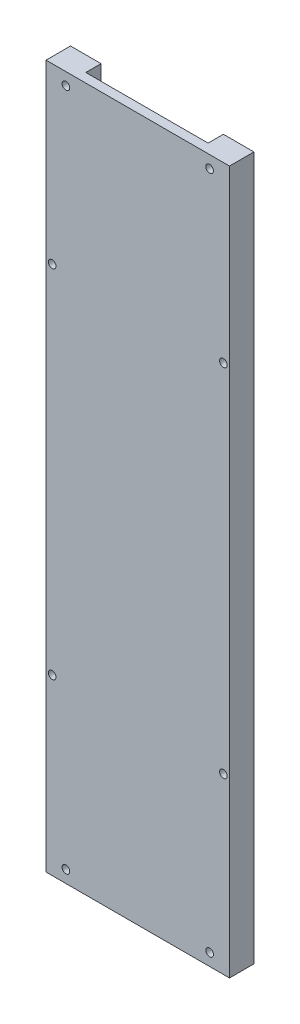
ISO-10303-21;
HEADER;
FILE_DESCRIPTION(('STEP AP214'),'2;1');
FILE_NAME('part.step','',(''),(''),'','','');
FILE_SCHEMA(('AUTOMOTIVE_DESIGN { 1 0 10303 214 1 1 1 1 }'));
ENDSEC;
DATA;
#1=APPLICATION_CONTEXT('core data for automotive mechanical design processes');
#2=APPLICATION_PROTOCOL_DEFINITION('international standard','automotive_design',2000,#1);
#3=PRODUCT_CONTEXT('',#1,'mechanical');
#4=PRODUCT('Part','Part','',(#3));
#5=PRODUCT_RELATED_PRODUCT_CATEGORY('part','',(#4));
#6=PRODUCT_DEFINITION_FORMATION('','',#4);
#7=PRODUCT_DEFINITION_CONTEXT('part definition',#1,'design');
#8=PRODUCT_DEFINITION('design','',#6,#7);
#9=PRODUCT_DEFINITION_SHAPE('','',#8);
#10=(LENGTH_UNIT() NAMED_UNIT(*) SI_UNIT(.MILLI.,.METRE.));
#11=(NAMED_UNIT(*) PLANE_ANGLE_UNIT() SI_UNIT($,.RADIAN.));
#12=(NAMED_UNIT(*) SI_UNIT($,.STERADIAN.) SOLID_ANGLE_UNIT());
#13=UNCERTAINTY_MEASURE_WITH_UNIT(LENGTH_MEASURE(1.E-05),#10,'distance_accuracy_value','');
#14=(GEOMETRIC_REPRESENTATION_CONTEXT(3) GLOBAL_UNCERTAINTY_ASSIGNED_CONTEXT((#13)) GLOBAL_UNIT_ASSIGNED_CONTEXT((#10,
#11,#12)) REPRESENTATION_CONTEXT('',''));
#15=CARTESIAN_POINT('',(0.,0.,0.));
#16=DIRECTION('',(0.,0.,1.));
#17=DIRECTION('',(1.,0.,0.));
#18=AXIS2_PLACEMENT_3D('',#15,#16,#17);
#19=CARTESIAN_POINT('',(75.000433107579,240.178928217637,30.5));
#20=DIRECTION('',(-9.09271131818108E-09,1.,0.));
#21=DIRECTION('',(0.,0.,1.));
#22=AXIS2_PLACEMENT_3D('',#19,#20,#21);
#23=PLANE('',#22);
#24=DIRECTION('',(-1.,-9.09271130611344E-09,0.));
#25=VECTOR('',#24,1.);
#26=CARTESIAN_POINT('',(55.000433107579,240.178928035783,58.));
#27=LINE('',#26,#25);
#28=CARTESIAN_POINT('',(95.000433107579,240.178928399491,58.));
#29=VERTEX_POINT('',#28);
#30=CARTESIAN_POINT('',(55.000433107579,240.178928035783,58.));
#31=VERTEX_POINT('',#30);
#32=EDGE_CURVE('E11',#29,#31,#27,.T.);
#33=ORIENTED_EDGE('',*,*,#32,.T.);
#34=DIRECTION('',(0.,0.,-1.));
#35=VECTOR('',#34,1.);
#36=CARTESIAN_POINT('',(55.000433107579,240.178928035783,53.));
#37=LINE('',#36,#35);
#38=CARTESIAN_POINT('',(55.000433107579,240.178928035783,53.));
#39=VERTEX_POINT('',#38);
#40=EDGE_CURVE('E181',#31,#39,#37,.T.);
#41=ORIENTED_EDGE('',*,*,#40,.T.);
#42=DIRECTION('',(-1.,-9.09271130611344E-09,0.));
#43=VECTOR('',#42,1.);
#44=CARTESIAN_POINT('',(45.000433107579,240.178927944856,53.));
#45=LINE('',#44,#43);
#46=CARTESIAN_POINT('',(45.000433107579,240.178927944856,53.));
#47=VERTEX_POINT('',#46);
#48=EDGE_CURVE('E206',#39,#47,#45,.T.);
#49=ORIENTED_EDGE('',*,*,#48,.T.);
#50=DIRECTION('',(0.,0.,1.));
#51=VECTOR('',#50,1.);
#52=CARTESIAN_POINT('',(45.000433107579,240.178927944856,61.));
#53=LINE('',#52,#51);
#54=CARTESIAN_POINT('',(45.000433107579,240.178927944856,61.));
#55=VERTEX_POINT('',#54);
#56=EDGE_CURVE('E201',#47,#55,#53,.T.);
#57=ORIENTED_EDGE('',*,*,#56,.T.);
#58=DIRECTION('',(1.,9.09271130611344E-09,0.));
#59=VECTOR('',#58,1.);
#60=CARTESIAN_POINT('',(105.000433107579,240.178928490418,61.));
#61=LINE('',#60,#59);
#62=CARTESIAN_POINT('',(105.000433107579,240.178928490418,61.));
#63=VERTEX_POINT('',#62);
#64=EDGE_CURVE('E281',#55,#63,#61,.T.);
#65=ORIENTED_EDGE('',*,*,#64,.T.);
#66=DIRECTION('',(0.,0.,-1.));
#67=VECTOR('',#66,1.);
#68=CARTESIAN_POINT('',(105.000433107579,240.178928490418,53.));
#69=LINE('',#68,#67);
#70=CARTESIAN_POINT('',(105.000433107579,240.178928490418,53.));
#71=VERTEX_POINT('',#70);
#72=EDGE_CURVE('E259',#63,#71,#69,.T.);
#73=ORIENTED_EDGE('',*,*,#72,.T.);
#74=DIRECTION('',(-1.,-9.09271130611344E-09,0.));
#75=VECTOR('',#74,1.);
#76=CARTESIAN_POINT('',(45.000433107579,240.178927944856,53.));
#77=LINE('',#76,#75);
#78=CARTESIAN_POINT('',(95.000433107579,240.178928399491,53.));
#79=VERTEX_POINT('',#78);
#80=EDGE_CURVE('E190',#71,#79,#77,.T.);
#81=ORIENTED_EDGE('',*,*,#80,.T.);
#82=DIRECTION('',(0.,0.,1.));
#83=VECTOR('',#82,1.);
#84=CARTESIAN_POINT('',(95.000433107579,240.178928399491,58.));
#85=LINE('',#84,#83);
#86=EDGE_CURVE('E229',#79,#29,#85,.T.);
#87=ORIENTED_EDGE('',*,*,#86,.T.);
#88=EDGE_LOOP('',(#33,#41,#49,#57,#65,#73,#81,#87));
#89=FACE_BOUND('',#88,.T.);
#90=ADVANCED_FACE('F16',(#89),#23,.T.);
#91=CARTESIAN_POINT('',(75.0004351989026,10.1789282176369,30.5));
#92=DIRECTION('',(9.09271130611344E-09,-1.,0.));
#93=DIRECTION('',(0.,0.,-1.));
#94=AXIS2_PLACEMENT_3D('',#91,#92,#93);
#95=PLANE('',#94);
#96=DIRECTION('',(1.,9.09271130611344E-09,0.));
#97=VECTOR('',#96,1.);
#98=CARTESIAN_POINT('',(55.0004351989026,10.1789280357827,58.));
#99=LINE('',#98,#97);
#100=CARTESIAN_POINT('',(55.0004351989026,10.1789280357827,58.));
#101=VERTEX_POINT('',#100);
#102=CARTESIAN_POINT('',(95.0004351989026,10.1789283994911,58.));
#103=VERTEX_POINT('',#102);
#104=EDGE_CURVE('E27',#101,#103,#99,.T.);
#105=ORIENTED_EDGE('',*,*,#104,.T.);
#106=DIRECTION('',(0.,0.,-1.));
#107=VECTOR('',#106,1.);
#108=CARTESIAN_POINT('',(95.0004351989026,10.1789283994911,58.));
#109=LINE('',#108,#107);
#110=CARTESIAN_POINT('',(95.0004351989026,10.1789283994911,53.));
#111=VERTEX_POINT('',#110);
#112=EDGE_CURVE('E264',#103,#111,#109,.T.);
#113=ORIENTED_EDGE('',*,*,#112,.T.);
#114=DIRECTION('',(1.,9.09271130611344E-09,0.));
#115=VECTOR('',#114,1.);
#116=CARTESIAN_POINT('',(45.0004351989026,10.1789279448555,53.));
#117=LINE('',#116,#115);
#118=CARTESIAN_POINT('',(105.000435198903,10.1789284904182,53.));
#119=VERTEX_POINT('',#118);
#120=EDGE_CURVE('E194',#111,#119,#117,.T.);
#121=ORIENTED_EDGE('',*,*,#120,.T.);
#122=DIRECTION('',(0.,0.,1.));
#123=VECTOR('',#122,1.);
#124=CARTESIAN_POINT('',(105.000435198903,10.1789284904182,53.));
#125=LINE('',#124,#123);
#126=CARTESIAN_POINT('',(105.000435198903,10.1789284904182,61.));
#127=VERTEX_POINT('',#126);
#128=EDGE_CURVE('E224',#119,#127,#125,.T.);
#129=ORIENTED_EDGE('',*,*,#128,.T.);
#130=DIRECTION('',(-1.,-9.09271130611344E-09,0.));
#131=VECTOR('',#130,1.);
#132=CARTESIAN_POINT('',(105.000435198903,10.1789284904182,61.));
#133=LINE('',#132,#131);
#134=CARTESIAN_POINT('',(45.0004351989026,10.1789279448555,61.));
#135=VERTEX_POINT('',#134);
#136=EDGE_CURVE('E258',#127,#135,#133,.T.);
#137=ORIENTED_EDGE('',*,*,#136,.T.);
#138=DIRECTION('',(0.,0.,-1.));
#139=VECTOR('',#138,1.);
#140=CARTESIAN_POINT('',(45.0004351989026,10.1789279448555,61.));
#141=LINE('',#140,#139);
#142=CARTESIAN_POINT('',(45.0004351989026,10.1789279448555,53.));
#143=VERTEX_POINT('',#142);
#144=EDGE_CURVE('E205',#135,#143,#141,.T.);
#145=ORIENTED_EDGE('',*,*,#144,.T.);
#146=DIRECTION('',(1.,9.09271130611344E-09,0.));
#147=VECTOR('',#146,1.);
#148=CARTESIAN_POINT('',(45.0004351989026,10.1789279448555,53.));
#149=LINE('',#148,#147);
#150=CARTESIAN_POINT('',(55.0004351989026,10.1789280357827,53.));
#151=VERTEX_POINT('',#150);
#152=EDGE_CURVE('E209',#143,#151,#149,.T.);
#153=ORIENTED_EDGE('',*,*,#152,.T.);
#154=DIRECTION('',(0.,0.,1.));
#155=VECTOR('',#154,1.);
#156=CARTESIAN_POINT('',(55.0004351989026,10.1789280357827,53.));
#157=LINE('',#156,#155);
#158=EDGE_CURVE('E185',#151,#101,#157,.T.);
#159=ORIENTED_EDGE('',*,*,#158,.T.);
#160=EDGE_LOOP('',(#105,#113,#121,#129,#137,#145,#153,#159));
#161=FACE_BOUND('',#160,.T.);
#162=ADVANCED_FACE('F364',(#161),#95,.T.);
#163=CARTESIAN_POINT('',(95.0004351989026,10.1789283994911,58.));
#164=DIRECTION('',(0.,0.,-1.));
#165=DIRECTION('',(0.,-1.,0.));
#166=AXIS2_PLACEMENT_3D('',#163,#164,#165);
#167=PLANE('',#166);
#168=ORIENTED_EDGE('',*,*,#104,.F.);
#169=DIRECTION('',(-9.09271131818108E-09,1.,0.));
#170=VECTOR('',#169,1.);
#171=CARTESIAN_POINT('',(55.0004351989026,10.1789280357827,58.));
#172=LINE('',#171,#170);
#173=EDGE_CURVE('E184',#101,#31,#172,.T.);
#174=ORIENTED_EDGE('',*,*,#173,.T.);
#175=ORIENTED_EDGE('',*,*,#32,.F.);
#176=DIRECTION('',(-9.09271131818108E-09,1.,0.));
#177=VECTOR('',#176,1.);
#178=CARTESIAN_POINT('',(95.0004351989026,10.1789283994911,58.));
#179=LINE('',#178,#177);
#180=EDGE_CURVE('E247',#103,#29,#179,.T.);
#181=ORIENTED_EDGE('',*,*,#180,.F.);
#182=EDGE_LOOP('',(#168,#174,#175,#181));
#183=FACE_BOUND('',#182,.T.);
#184=ADVANCED_FACE('F359',(#183),#167,.T.);
#185=CARTESIAN_POINT('',(55.0004351989026,10.1789280357827,58.));
#186=DIRECTION('',(1.,9.09271131818108E-09,0.));
#187=DIRECTION('',(0.,0.,-1.));
#188=AXIS2_PLACEMENT_3D('',#185,#186,#187);
#189=PLANE('',#188);
#190=ORIENTED_EDGE('',*,*,#158,.F.);
#191=DIRECTION('',(-9.09271131818108E-09,1.,0.));
#192=VECTOR('',#191,1.);
#193=CARTESIAN_POINT('',(55.0004351989026,10.1789280357827,53.));
#194=LINE('',#193,#192);
#195=EDGE_CURVE('E189',#151,#39,#194,.T.);
#196=ORIENTED_EDGE('',*,*,#195,.T.);
#197=ORIENTED_EDGE('',*,*,#40,.F.);
#198=ORIENTED_EDGE('',*,*,#173,.F.);
#199=EDGE_LOOP('',(#190,#196,#197,#198));
#200=FACE_BOUND('',#199,.T.);
#201=ADVANCED_FACE('F350',(#200),#189,.T.);
#202=CARTESIAN_POINT('',(55.0004351989026,10.1789280357827,53.));
#203=DIRECTION('',(0.,0.,-1.));
#204=DIRECTION('',(0.,-1.,0.));
#205=AXIS2_PLACEMENT_3D('',#202,#203,#204);
#206=PLANE('',#205);
#207=CARTESIAN_POINT('',(51.5004331439499,236.178928003958,53.));
#208=DIRECTION('',(0.,0.,1.));
#209=DIRECTION('',(-1.,0.,0.));
#210=AXIS2_PLACEMENT_3D('',#207,#208,#209);
#211=CIRCLE('',#210,1.25);
#212=CARTESIAN_POINT('',(52.7504331439499,236.178928003958,53.));
#213=VERTEX_POINT('',#212);
#214=EDGE_CURVE('E273',#213,#213,#211,.T.);
#215=ORIENTED_EDGE('',*,*,#214,.T.);
#216=EDGE_LOOP('',(#215));
#217=FACE_BOUND('',#216,.T.);
#218=CARTESIAN_POINT('',(46.9998050230108,183.403261062844,53.));
#219=DIRECTION('',(0.,0.,1.));
#220=DIRECTION('',(-1.,0.,0.));
#221=AXIS2_PLACEMENT_3D('',#218,#219,#220);
#222=CIRCLE('',#221,1.25);
#223=CARTESIAN_POINT('',(48.2498050230108,183.403261062844,53.));
#224=VERTEX_POINT('',#223);
#225=EDGE_CURVE('E161',#224,#224,#222,.T.);
#226=ORIENTED_EDGE('',*,*,#225,.T.);
#227=EDGE_LOOP('',(#226));
#228=FACE_BOUND('',#227,.T.);
#229=CARTESIAN_POINT('',(51.5004351625318,14.1789280039582,53.));
#230=DIRECTION('',(0.,0.,1.));
#231=DIRECTION('',(-1.,0.,0.));
#232=AXIS2_PLACEMENT_3D('',#229,#230,#231);
#233=CIRCLE('',#232,1.25);
#234=CARTESIAN_POINT('',(52.7504351625318,14.1789280039582,53.));
#235=VERTEX_POINT('',#234);
#236=EDGE_CURVE('E20',#235,#235,#233,.T.);
#237=ORIENTED_EDGE('',*,*,#236,.T.);
#238=EDGE_LOOP('',(#237));
#239=FACE_BOUND('',#238,.T.);
#240=CARTESIAN_POINT('',(46.9998060814321,66.9999997454023,53.));
#241=DIRECTION('',(0.,0.,1.));
#242=DIRECTION('',(-1.,0.,0.));
#243=AXIS2_PLACEMENT_3D('',#240,#241,#242);
#244=CIRCLE('',#243,1.25);
#245=CARTESIAN_POINT('',(48.2498060814321,66.9999997454023,53.));
#246=VERTEX_POINT('',#245);
#247=EDGE_CURVE('E200',#246,#246,#244,.T.);
#248=ORIENTED_EDGE('',*,*,#247,.T.);
#249=EDGE_LOOP('',(#248));
#250=FACE_BOUND('',#249,.T.);
#251=ORIENTED_EDGE('',*,*,#152,.F.);
#252=DIRECTION('',(-9.09271131818108E-09,1.,0.));
#253=VECTOR('',#252,1.);
#254=CARTESIAN_POINT('',(45.0004351989026,10.1789279448555,53.));
#255=LINE('',#254,#253);
#256=EDGE_CURVE('E204',#143,#47,#255,.T.);
#257=ORIENTED_EDGE('',*,*,#256,.T.);
#258=ORIENTED_EDGE('',*,*,#48,.F.);
#259=ORIENTED_EDGE('',*,*,#195,.F.);
#260=EDGE_LOOP('',(#251,#257,#258,#259));
#261=FACE_BOUND('',#260,.T.);
#262=ADVANCED_FACE('F166',(#217,#228,#239,#250,#261),#206,.T.);
#263=CARTESIAN_POINT('',(45.0004351989026,10.1789279448555,53.));
#264=DIRECTION('',(-1.,-9.09271131818108E-09,0.));
#265=DIRECTION('',(-9.09271131818108E-09,1.,0.));
#266=AXIS2_PLACEMENT_3D('',#263,#264,#265);
#267=PLANE('',#266);
#268=ORIENTED_EDGE('',*,*,#144,.F.);
#269=DIRECTION('',(-9.09271131818108E-09,1.,0.));
#270=VECTOR('',#269,1.);
#271=CARTESIAN_POINT('',(45.0004351989026,10.1789279448555,61.));
#272=LINE('',#271,#270);
#273=EDGE_CURVE('E233',#135,#55,#272,.T.);
#274=ORIENTED_EDGE('',*,*,#273,.T.);
#275=ORIENTED_EDGE('',*,*,#56,.F.);
#276=ORIENTED_EDGE('',*,*,#256,.F.);
#277=EDGE_LOOP('',(#268,#274,#275,#276));
#278=FACE_BOUND('',#277,.T.);
#279=ADVANCED_FACE('F349',(#278),#267,.T.);
#280=CARTESIAN_POINT('',(45.0004351989026,10.1789279448555,61.));
#281=DIRECTION('',(0.,0.,1.));
#282=DIRECTION('',(1.,0.,0.));
#283=AXIS2_PLACEMENT_3D('',#280,#281,#282);
#284=PLANE('',#283);
#285=CARTESIAN_POINT('',(51.5004331439499,236.178928003958,61.));
#286=DIRECTION('',(0.,0.,-1.));
#287=DIRECTION('',(-1.,0.,0.));
#288=AXIS2_PLACEMENT_3D('',#285,#286,#287);
#289=CIRCLE('',#288,1.25);
#290=CARTESIAN_POINT('',(52.7504331439499,236.178928003958,61.));
#291=VERTEX_POINT('',#290);
#292=EDGE_CURVE('E179',#291,#291,#289,.T.);
#293=ORIENTED_EDGE('',*,*,#292,.T.);
#294=EDGE_LOOP('',(#293));
#295=FACE_BOUND('',#294,.T.);
#296=CARTESIAN_POINT('',(46.9998050230108,183.403261062844,61.));
#297=DIRECTION('',(0.,0.,-1.));
#298=DIRECTION('',(-1.,0.,0.));
#299=AXIS2_PLACEMENT_3D('',#296,#297,#298);
#300=CIRCLE('',#299,1.25);
#301=CARTESIAN_POINT('',(48.2498050230108,183.403261062844,61.));
#302=VERTEX_POINT('',#301);
#303=EDGE_CURVE('E162',#302,#302,#300,.T.);
#304=ORIENTED_EDGE('',*,*,#303,.T.);
#305=EDGE_LOOP('',(#304));
#306=FACE_BOUND('',#305,.T.);
#307=CARTESIAN_POINT('',(98.4995769952185,236.178928217633,61.));
#308=DIRECTION('',(0.,0.,-1.));
#309=DIRECTION('',(-1.,0.,0.));
#310=AXIS2_PLACEMENT_3D('',#307,#308,#309);
#311=CIRCLE('',#310,1.25);
#312=CARTESIAN_POINT('',(99.7495769952185,236.178928217633,61.));
#313=VERTEX_POINT('',#312);
#314=EDGE_CURVE('E169',#313,#313,#311,.T.);
#315=ORIENTED_EDGE('',*,*,#314,.T.);
#316=EDGE_LOOP('',(#315));
#317=FACE_BOUND('',#316,.T.);
#318=CARTESIAN_POINT('',(103.000205596031,183.403261317442,61.));
#319=DIRECTION('',(0.,0.,-1.));
#320=DIRECTION('',(-1.,0.,0.));
#321=AXIS2_PLACEMENT_3D('',#318,#319,#320);
#322=CIRCLE('',#321,1.25);
#323=CARTESIAN_POINT('',(104.250205596031,183.403261317442,61.));
#324=VERTEX_POINT('',#323);
#325=EDGE_CURVE('E220',#324,#324,#322,.T.);
#326=ORIENTED_EDGE('',*,*,#325,.T.);
#327=EDGE_LOOP('',(#326));
#328=FACE_BOUND('',#327,.T.);
#329=CARTESIAN_POINT('',(103.000205596031,67.,61.));
#330=DIRECTION('',(0.,0.,-1.));
#331=DIRECTION('',(-1.,0.,0.));
#332=AXIS2_PLACEMENT_3D('',#329,#330,#331);
#333=CIRCLE('',#332,1.25);
#334=CARTESIAN_POINT('',(104.250205596031,67.,61.));
#335=VERTEX_POINT('',#334);
#336=EDGE_CURVE('E215',#335,#335,#333,.T.);
#337=ORIENTED_EDGE('',*,*,#336,.T.);
#338=EDGE_LOOP('',(#337));
#339=FACE_BOUND('',#338,.T.);
#340=CARTESIAN_POINT('',(98.4995769952185,14.178928217633,61.));
#341=DIRECTION('',(0.,0.,-1.));
#342=DIRECTION('',(-1.,0.,0.));
#343=AXIS2_PLACEMENT_3D('',#340,#341,#342);
#344=CIRCLE('',#343,1.25);
#345=CARTESIAN_POINT('',(99.7495769952185,14.178928217633,61.));
#346=VERTEX_POINT('',#345);
#347=EDGE_CURVE('E251',#346,#346,#344,.T.);
#348=ORIENTED_EDGE('',*,*,#347,.T.);
#349=EDGE_LOOP('',(#348));
#350=FACE_BOUND('',#349,.T.);
#351=CARTESIAN_POINT('',(51.5004351625318,14.1789280039582,61.));
#352=DIRECTION('',(0.,0.,-1.));
#353=DIRECTION('',(-1.,0.,0.));
#354=AXIS2_PLACEMENT_3D('',#351,#352,#353);
#355=CIRCLE('',#354,1.25);
#356=CARTESIAN_POINT('',(52.7504351625318,14.1789280039582,61.));
#357=VERTEX_POINT('',#356);
#358=EDGE_CURVE('E244',#357,#357,#355,.T.);
#359=ORIENTED_EDGE('',*,*,#358,.T.);
#360=EDGE_LOOP('',(#359));
#361=FACE_BOUND('',#360,.T.);
#362=CARTESIAN_POINT('',(46.9998060814321,66.9999997454023,61.));
#363=DIRECTION('',(0.,0.,-1.));
#364=DIRECTION('',(-1.,0.,0.));
#365=AXIS2_PLACEMENT_3D('',#362,#363,#364);
#366=CIRCLE('',#365,1.25);
#367=CARTESIAN_POINT('',(48.2498060814321,66.9999997454023,61.));
#368=VERTEX_POINT('',#367);
#369=EDGE_CURVE('E199',#368,#368,#366,.T.);
#370=ORIENTED_EDGE('',*,*,#369,.T.);
#371=EDGE_LOOP('',(#370));
#372=FACE_BOUND('',#371,.T.);
#373=ORIENTED_EDGE('',*,*,#136,.F.);
#374=DIRECTION('',(-9.09271131818108E-09,1.,0.));
#375=VECTOR('',#374,1.);
#376=CARTESIAN_POINT('',(105.000435198903,10.1789284904182,61.));
#377=LINE('',#376,#375);
#378=EDGE_CURVE('E254',#127,#63,#377,.T.);
#379=ORIENTED_EDGE('',*,*,#378,.T.);
#380=ORIENTED_EDGE('',*,*,#64,.F.);
#381=ORIENTED_EDGE('',*,*,#273,.F.);
#382=EDGE_LOOP('',(#373,#379,#380,#381));
#383=FACE_BOUND('',#382,.T.);
#384=ADVANCED_FACE('F344',(#295,#306,#317,#328,#339,#350,#361,#372,#383),#284,.T.);
#385=CARTESIAN_POINT('',(105.000435198903,10.1789284904182,61.));
#386=DIRECTION('',(1.,9.09271131818108E-09,0.));
#387=DIRECTION('',(0.,0.,-1.));
#388=AXIS2_PLACEMENT_3D('',#385,#386,#387);
#389=PLANE('',#388);
#390=ORIENTED_EDGE('',*,*,#128,.F.);
#391=DIRECTION('',(-9.09271131818108E-09,1.,0.));
#392=VECTOR('',#391,1.);
#393=CARTESIAN_POINT('',(105.000435198903,10.1789284904182,53.));
#394=LINE('',#393,#392);
#395=EDGE_CURVE('E193',#119,#71,#394,.T.);
#396=ORIENTED_EDGE('',*,*,#395,.T.);
#397=ORIENTED_EDGE('',*,*,#72,.F.);
#398=ORIENTED_EDGE('',*,*,#378,.F.);
#399=EDGE_LOOP('',(#390,#396,#397,#398));
#400=FACE_BOUND('',#399,.T.);
#401=ADVANCED_FACE('F388',(#400),#389,.T.);
#402=CARTESIAN_POINT('',(105.000435198903,10.1789284904182,53.));
#403=DIRECTION('',(0.,0.,-1.));
#404=DIRECTION('',(0.,-1.,0.));
#405=AXIS2_PLACEMENT_3D('',#402,#403,#404);
#406=PLANE('',#405);
#407=CARTESIAN_POINT('',(98.4995769952185,236.178928217633,53.));
#408=DIRECTION('',(0.,0.,1.));
#409=DIRECTION('',(-1.,0.,0.));
#410=AXIS2_PLACEMENT_3D('',#407,#408,#409);
#411=CIRCLE('',#410,1.25);
#412=CARTESIAN_POINT('',(99.7495769952185,236.178928217633,53.));
#413=VERTEX_POINT('',#412);
#414=EDGE_CURVE('E216',#413,#413,#411,.T.);
#415=ORIENTED_EDGE('',*,*,#414,.T.);
#416=EDGE_LOOP('',(#415));
#417=FACE_BOUND('',#416,.T.);
#418=CARTESIAN_POINT('',(103.000205596031,183.403261317442,53.));
#419=DIRECTION('',(0.,0.,1.));
#420=DIRECTION('',(-1.,0.,0.));
#421=AXIS2_PLACEMENT_3D('',#418,#419,#420);
#422=CIRCLE('',#421,1.25);
#423=CARTESIAN_POINT('',(104.250205596031,183.403261317442,53.));
#424=VERTEX_POINT('',#423);
#425=EDGE_CURVE('E210',#424,#424,#422,.T.);
#426=ORIENTED_EDGE('',*,*,#425,.T.);
#427=EDGE_LOOP('',(#426));
#428=FACE_BOUND('',#427,.T.);
#429=CARTESIAN_POINT('',(103.000205596031,67.,53.));
#430=DIRECTION('',(0.,0.,1.));
#431=DIRECTION('',(-1.,0.,0.));
#432=AXIS2_PLACEMENT_3D('',#429,#430,#431);
#433=CIRCLE('',#432,1.25);
#434=CARTESIAN_POINT('',(104.250205596031,67.,53.));
#435=VERTEX_POINT('',#434);
#436=EDGE_CURVE('E238',#435,#435,#433,.T.);
#437=ORIENTED_EDGE('',*,*,#436,.T.);
#438=EDGE_LOOP('',(#437));
#439=FACE_BOUND('',#438,.T.);
#440=CARTESIAN_POINT('',(98.4995769952185,14.178928217633,53.));
#441=DIRECTION('',(0.,0.,1.));
#442=DIRECTION('',(-1.,0.,0.));
#443=AXIS2_PLACEMENT_3D('',#440,#441,#442);
#444=CIRCLE('',#443,1.25);
#445=CARTESIAN_POINT('',(99.7495769952185,14.178928217633,53.));
#446=VERTEX_POINT('',#445);
#447=EDGE_CURVE('E239',#446,#446,#444,.T.);
#448=ORIENTED_EDGE('',*,*,#447,.T.);
#449=EDGE_LOOP('',(#448));
#450=FACE_BOUND('',#449,.T.);
#451=ORIENTED_EDGE('',*,*,#120,.F.);
#452=DIRECTION('',(-9.09271131818108E-09,1.,0.));
#453=VECTOR('',#452,1.);
#454=CARTESIAN_POINT('',(95.0004351989026,10.1789283994911,53.));
#455=LINE('',#454,#453);
#456=EDGE_CURVE('E225',#111,#79,#455,.T.);
#457=ORIENTED_EDGE('',*,*,#456,.T.);
#458=ORIENTED_EDGE('',*,*,#80,.F.);
#459=ORIENTED_EDGE('',*,*,#395,.F.);
#460=EDGE_LOOP('',(#451,#457,#458,#459));
#461=FACE_BOUND('',#460,.T.);
#462=ADVANCED_FACE('F377',(#417,#428,#439,#450,#461),#406,.T.);
#463=CARTESIAN_POINT('',(95.0004351989026,10.1789283994911,53.));
#464=DIRECTION('',(-1.,-9.09271131818108E-09,0.));
#465=DIRECTION('',(-9.09271131818108E-09,1.,0.));
#466=AXIS2_PLACEMENT_3D('',#463,#464,#465);
#467=PLANE('',#466);
#468=ORIENTED_EDGE('',*,*,#112,.F.);
#469=ORIENTED_EDGE('',*,*,#180,.T.);
#470=ORIENTED_EDGE('',*,*,#86,.F.);
#471=ORIENTED_EDGE('',*,*,#456,.F.);
#472=EDGE_LOOP('',(#468,#469,#470,#471));
#473=FACE_BOUND('',#472,.T.);
#474=ADVANCED_FACE('F374',(#473),#467,.T.);
#475=CARTESIAN_POINT('',(51.5004331439499,236.178928003958,53.));
#476=DIRECTION('',(0.,0.,1.));
#477=DIRECTION('',(-1.,0.,0.));
#478=AXIS2_PLACEMENT_3D('',#475,#476,#477);
#479=CYLINDRICAL_SURFACE('',#478,1.25);
#480=ORIENTED_EDGE('',*,*,#214,.F.);
#481=DIRECTION('',(0.,0.,1.));
#482=VECTOR('',#481,1.);
#483=CARTESIAN_POINT('',(52.7504331439499,236.178928003958,53.));
#484=LINE('',#483,#482);
#485=EDGE_CURVE('E277',#213,#291,#484,.T.);
#486=ORIENTED_EDGE('',*,*,#485,.T.);
#487=ORIENTED_EDGE('',*,*,#292,.F.);
#488=ORIENTED_EDGE('',*,*,#485,.F.);
#489=EDGE_LOOP('',(#480,#486,#487,#488));
#490=FACE_BOUND('',#489,.T.);
#491=ADVANCED_FACE('F346',(#490),#479,.F.);
#492=CARTESIAN_POINT('',(46.9998050230108,183.403261062844,53.));
#493=DIRECTION('',(0.,0.,1.));
#494=DIRECTION('',(-1.,0.,0.));
#495=AXIS2_PLACEMENT_3D('',#492,#493,#494);
#496=CYLINDRICAL_SURFACE('',#495,1.25);
#497=ORIENTED_EDGE('',*,*,#225,.F.);
#498=DIRECTION('',(0.,0.,1.));
#499=VECTOR('',#498,1.);
#500=CARTESIAN_POINT('',(48.2498050230108,183.403261062844,53.));
#501=LINE('',#500,#499);
#502=EDGE_CURVE('E158',#224,#302,#501,.T.);
#503=ORIENTED_EDGE('',*,*,#502,.T.);
#504=ORIENTED_EDGE('',*,*,#303,.F.);
#505=ORIENTED_EDGE('',*,*,#502,.F.);
#506=EDGE_LOOP('',(#497,#503,#504,#505));
#507=FACE_BOUND('',#506,.T.);
#508=ADVANCED_FACE('F160',(#507),#496,.F.);
#509=CARTESIAN_POINT('',(98.4995769952185,236.178928217633,53.));
#510=DIRECTION('',(0.,0.,1.));
#511=DIRECTION('',(-1.,0.,0.));
#512=AXIS2_PLACEMENT_3D('',#509,#510,#511);
#513=CYLINDRICAL_SURFACE('',#512,1.25);
#514=ORIENTED_EDGE('',*,*,#414,.F.);
#515=DIRECTION('',(0.,0.,1.));
#516=VECTOR('',#515,1.);
#517=CARTESIAN_POINT('',(99.7495769952185,236.178928217633,53.));
#518=LINE('',#517,#516);
#519=EDGE_CURVE('E175',#413,#313,#518,.T.);
#520=ORIENTED_EDGE('',*,*,#519,.T.);
#521=ORIENTED_EDGE('',*,*,#314,.F.);
#522=ORIENTED_EDGE('',*,*,#519,.F.);
#523=EDGE_LOOP('',(#514,#520,#521,#522));
#524=FACE_BOUND('',#523,.T.);
#525=ADVANCED_FACE('F372',(#524),#513,.F.);
#526=CARTESIAN_POINT('',(103.000205596031,183.403261317442,53.));
#527=DIRECTION('',(0.,0.,1.));
#528=DIRECTION('',(-1.,0.,0.));
#529=AXIS2_PLACEMENT_3D('',#526,#527,#528);
#530=CYLINDRICAL_SURFACE('',#529,1.25);
#531=ORIENTED_EDGE('',*,*,#425,.F.);
#532=DIRECTION('',(0.,0.,1.));
#533=VECTOR('',#532,1.);
#534=CARTESIAN_POINT('',(104.250205596031,183.403261317442,53.));
#535=LINE('',#534,#533);
#536=EDGE_CURVE('E214',#424,#324,#535,.T.);
#537=ORIENTED_EDGE('',*,*,#536,.T.);
#538=ORIENTED_EDGE('',*,*,#325,.F.);
#539=ORIENTED_EDGE('',*,*,#536,.F.);
#540=EDGE_LOOP('',(#531,#537,#538,#539));
#541=FACE_BOUND('',#540,.T.);
#542=ADVANCED_FACE('F382',(#541),#530,.F.);
#543=CARTESIAN_POINT('',(103.000205596031,67.,53.));
#544=DIRECTION('',(0.,0.,1.));
#545=DIRECTION('',(-1.,0.,0.));
#546=AXIS2_PLACEMENT_3D('',#543,#544,#545);
#547=CYLINDRICAL_SURFACE('',#546,1.25);
#548=ORIENTED_EDGE('',*,*,#436,.F.);
#549=DIRECTION('',(0.,0.,1.));
#550=VECTOR('',#549,1.);
#551=CARTESIAN_POINT('',(104.250205596031,67.,53.));
#552=LINE('',#551,#550);
#553=EDGE_CURVE('E234',#435,#335,#552,.T.);
#554=ORIENTED_EDGE('',*,*,#553,.T.);
#555=ORIENTED_EDGE('',*,*,#336,.F.);
#556=ORIENTED_EDGE('',*,*,#553,.F.);
#557=EDGE_LOOP('',(#548,#554,#555,#556));
#558=FACE_BOUND('',#557,.T.);
#559=ADVANCED_FACE('F379',(#558),#547,.F.);
#560=CARTESIAN_POINT('',(98.4995769952185,14.178928217633,53.));
#561=DIRECTION('',(0.,0.,1.));
#562=DIRECTION('',(-1.,0.,0.));
#563=AXIS2_PLACEMENT_3D('',#560,#561,#562);
#564=CYLINDRICAL_SURFACE('',#563,1.25);
#565=ORIENTED_EDGE('',*,*,#447,.F.);
#566=DIRECTION('',(0.,0.,1.));
#567=VECTOR('',#566,1.);
#568=CARTESIAN_POINT('',(99.7495769952185,14.178928217633,53.));
#569=LINE('',#568,#567);
#570=EDGE_CURVE('E243',#446,#346,#569,.T.);
#571=ORIENTED_EDGE('',*,*,#570,.T.);
#572=ORIENTED_EDGE('',*,*,#347,.F.);
#573=ORIENTED_EDGE('',*,*,#570,.F.);
#574=EDGE_LOOP('',(#565,#571,#572,#573));
#575=FACE_BOUND('',#574,.T.);
#576=ADVANCED_FACE('F18',(#575),#564,.F.);
#577=CARTESIAN_POINT('',(51.5004351625318,14.1789280039582,53.));
#578=DIRECTION('',(0.,0.,1.));
#579=DIRECTION('',(-1.,0.,0.));
#580=AXIS2_PLACEMENT_3D('',#577,#578,#579);
#581=CYLINDRICAL_SURFACE('',#580,1.25);
#582=ORIENTED_EDGE('',*,*,#236,.F.);
#583=DIRECTION('',(0.,0.,1.));
#584=VECTOR('',#583,1.);
#585=CARTESIAN_POINT('',(52.7504351625318,14.1789280039582,53.));
#586=LINE('',#585,#584);
#587=EDGE_CURVE('E260',#235,#357,#586,.T.);
#588=ORIENTED_EDGE('',*,*,#587,.T.);
#589=ORIENTED_EDGE('',*,*,#358,.F.);
#590=ORIENTED_EDGE('',*,*,#587,.F.);
#591=EDGE_LOOP('',(#582,#588,#589,#590));
#592=FACE_BOUND('',#591,.T.);
#593=ADVANCED_FACE('F420',(#592),#581,.F.);
#594=CARTESIAN_POINT('',(46.9998060814321,66.9999997454023,53.));
#595=DIRECTION('',(0.,0.,1.));
#596=DIRECTION('',(-1.,0.,0.));
#597=AXIS2_PLACEMENT_3D('',#594,#595,#596);
#598=CYLINDRICAL_SURFACE('',#597,1.25);
#599=ORIENTED_EDGE('',*,*,#247,.F.);
#600=DIRECTION('',(0.,0.,1.));
#601=VECTOR('',#600,1.);
#602=CARTESIAN_POINT('',(48.2498060814321,66.9999997454023,53.));
#603=LINE('',#602,#601);
#604=EDGE_CURVE('E195',#246,#368,#603,.T.);
#605=ORIENTED_EDGE('',*,*,#604,.T.);
#606=ORIENTED_EDGE('',*,*,#369,.F.);
#607=ORIENTED_EDGE('',*,*,#604,.F.);
#608=EDGE_LOOP('',(#599,#605,#606,#607));
#609=FACE_BOUND('',#608,.T.);
#610=ADVANCED_FACE('F418',(#609),#598,.F.);
#611=CLOSED_SHELL('',(#90,#162,#184,#201,#262,#279,#384,#401,#462,#474,#491,#508,#525,#542,#559,
#576,#593,#610));
#612=MANIFOLD_SOLID_BREP('B1',#611);
#613=ADVANCED_BREP_SHAPE_REPRESENTATION('',(#18,#612),#14);
#614=SHAPE_DEFINITION_REPRESENTATION(#9,#613);
ENDSEC;
END-ISO-10303-21;
